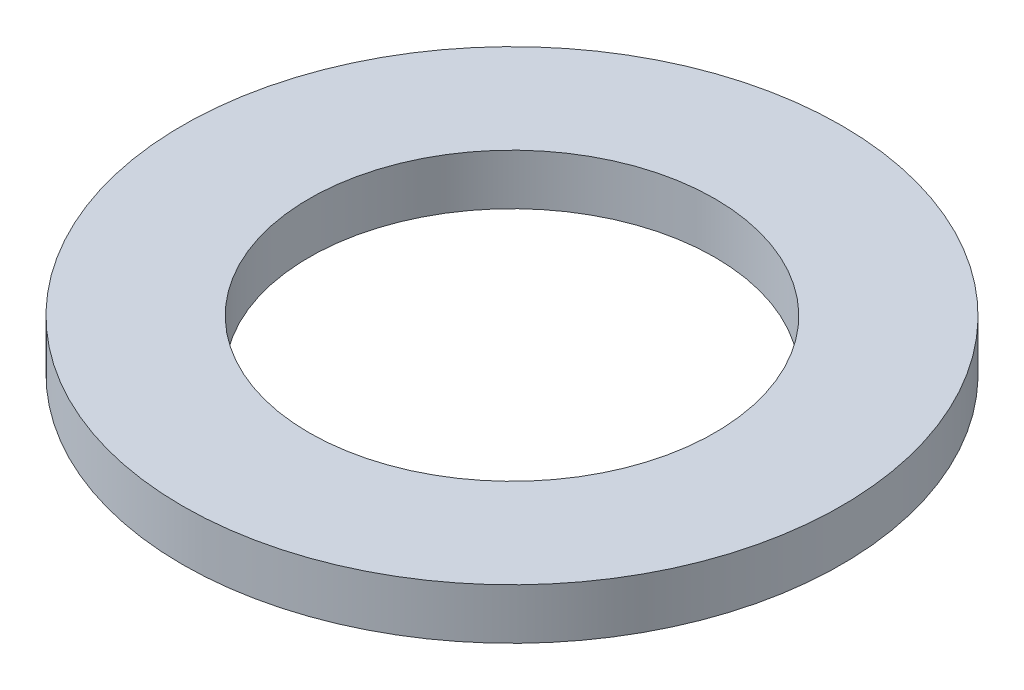
ISO-10303-21;
HEADER;
FILE_DESCRIPTION(('STEP AP214'),'2;1');
FILE_NAME('part.step','',(''),(''),'','','');
FILE_SCHEMA(('AUTOMOTIVE_DESIGN { 1 0 10303 214 1 1 1 1 }'));
ENDSEC;
DATA;
#1=APPLICATION_CONTEXT('core data for automotive mechanical design processes');
#2=APPLICATION_PROTOCOL_DEFINITION('international standard','automotive_design',2000,#1);
#3=PRODUCT_CONTEXT('',#1,'mechanical');
#4=PRODUCT('Part','Part','',(#3));
#5=PRODUCT_RELATED_PRODUCT_CATEGORY('part','',(#4));
#6=PRODUCT_DEFINITION_FORMATION('','',#4);
#7=PRODUCT_DEFINITION_CONTEXT('part definition',#1,'design');
#8=PRODUCT_DEFINITION('design','',#6,#7);
#9=PRODUCT_DEFINITION_SHAPE('','',#8);
#10=(LENGTH_UNIT() NAMED_UNIT(*) SI_UNIT(.MILLI.,.METRE.));
#11=(NAMED_UNIT(*) PLANE_ANGLE_UNIT() SI_UNIT($,.RADIAN.));
#12=(NAMED_UNIT(*) SI_UNIT($,.STERADIAN.) SOLID_ANGLE_UNIT());
#13=UNCERTAINTY_MEASURE_WITH_UNIT(LENGTH_MEASURE(1.E-05),#10,'distance_accuracy_value','');
#14=(GEOMETRIC_REPRESENTATION_CONTEXT(3) GLOBAL_UNCERTAINTY_ASSIGNED_CONTEXT((#13)) GLOBAL_UNIT_ASSIGNED_CONTEXT((#10,
#11,#12)) REPRESENTATION_CONTEXT('',''));
#15=CARTESIAN_POINT('',(0.,0.,0.));
#16=DIRECTION('',(0.,0.,1.));
#17=DIRECTION('',(1.,0.,0.));
#18=AXIS2_PLACEMENT_3D('',#15,#16,#17);
#19=CARTESIAN_POINT('',(0.,2.,0.));
#20=DIRECTION('',(0.,1.,0.));
#21=DIRECTION('',(0.,0.,1.));
#22=AXIS2_PLACEMENT_3D('',#19,#20,#21);
#23=PLANE('',#22);
#24=CARTESIAN_POINT('',(0.,2.,0.));
#25=DIRECTION('',(0.,1.,0.));
#26=DIRECTION('',(0.,0.,1.));
#27=AXIS2_PLACEMENT_3D('',#24,#25,#26);
#28=CIRCLE('',#27,13.);
#29=CARTESIAN_POINT('',(0.,2.,13.));
#30=VERTEX_POINT('',#29);
#31=EDGE_CURVE('E10',#30,#30,#28,.T.);
#32=ORIENTED_EDGE('',*,*,#31,.T.);
#33=EDGE_LOOP('',(#32));
#34=FACE_BOUND('',#33,.T.);
#35=CARTESIAN_POINT('',(0.,2.,0.));
#36=DIRECTION('',(0.,1.,0.));
#37=DIRECTION('',(0.,0.,1.));
#38=AXIS2_PLACEMENT_3D('',#35,#36,#37);
#39=CIRCLE('',#38,8.);
#40=CARTESIAN_POINT('',(0.,2.,8.));
#41=VERTEX_POINT('',#40);
#42=EDGE_CURVE('E46',#41,#41,#39,.T.);
#43=ORIENTED_EDGE('',*,*,#42,.F.);
#44=EDGE_LOOP('',(#43));
#45=FACE_BOUND('',#44,.T.);
#46=ADVANCED_FACE('F35',(#34,#45),#23,.T.);
#47=CARTESIAN_POINT('',(0.,0.,0.));
#48=DIRECTION('',(0.,1.,0.));
#49=DIRECTION('',(0.,0.,1.));
#50=AXIS2_PLACEMENT_3D('',#47,#48,#49);
#51=PLANE('',#50);
#52=CARTESIAN_POINT('',(0.,0.,0.));
#53=DIRECTION('',(0.,1.,0.));
#54=DIRECTION('',(0.,0.,1.));
#55=AXIS2_PLACEMENT_3D('',#52,#53,#54);
#56=CIRCLE('',#55,13.);
#57=CARTESIAN_POINT('',(0.,0.,13.));
#58=VERTEX_POINT('',#57);
#59=EDGE_CURVE('E39',#58,#58,#56,.T.);
#60=ORIENTED_EDGE('',*,*,#59,.F.);
#61=EDGE_LOOP('',(#60));
#62=FACE_BOUND('',#61,.T.);
#63=CARTESIAN_POINT('',(0.,0.,0.));
#64=DIRECTION('',(0.,1.,0.));
#65=DIRECTION('',(0.,0.,1.));
#66=AXIS2_PLACEMENT_3D('',#63,#64,#65);
#67=CIRCLE('',#66,8.);
#68=CARTESIAN_POINT('',(0.,0.,8.));
#69=VERTEX_POINT('',#68);
#70=EDGE_CURVE('E48',#69,#69,#67,.T.);
#71=ORIENTED_EDGE('',*,*,#70,.T.);
#72=EDGE_LOOP('',(#71));
#73=FACE_BOUND('',#72,.T.);
#74=ADVANCED_FACE('F58',(#62,#73),#51,.F.);
#75=CARTESIAN_POINT('',(0.,2.,0.));
#76=DIRECTION('',(0.,-1.,0.));
#77=DIRECTION('',(0.,0.,-1.));
#78=AXIS2_PLACEMENT_3D('',#75,#76,#77);
#79=CYLINDRICAL_SURFACE('',#78,13.);
#80=ORIENTED_EDGE('',*,*,#31,.F.);
#81=EDGE_LOOP('',(#80));
#82=FACE_BOUND('',#81,.T.);
#83=ORIENTED_EDGE('',*,*,#59,.T.);
#84=EDGE_LOOP('',(#83));
#85=FACE_BOUND('',#84,.T.);
#86=ADVANCED_FACE('F37',(#82,#85),#79,.T.);
#87=CARTESIAN_POINT('',(0.,2.,0.));
#88=DIRECTION('',(0.,-1.,0.));
#89=DIRECTION('',(0.,0.,-1.));
#90=AXIS2_PLACEMENT_3D('',#87,#88,#89);
#91=CYLINDRICAL_SURFACE('',#90,8.);
#92=ORIENTED_EDGE('',*,*,#42,.T.);
#93=EDGE_LOOP('',(#92));
#94=FACE_BOUND('',#93,.T.);
#95=ORIENTED_EDGE('',*,*,#70,.F.);
#96=EDGE_LOOP('',(#95));
#97=FACE_BOUND('',#96,.T.);
#98=ADVANCED_FACE('F54',(#94,#97),#91,.F.);
#99=CLOSED_SHELL('',(#46,#74,#86,#98));
#100=MANIFOLD_SOLID_BREP('B2',#99);
#101=ADVANCED_BREP_SHAPE_REPRESENTATION('',(#18,#100),#14);
#102=SHAPE_DEFINITION_REPRESENTATION(#9,#101);
ENDSEC;
END-ISO-10303-21;
